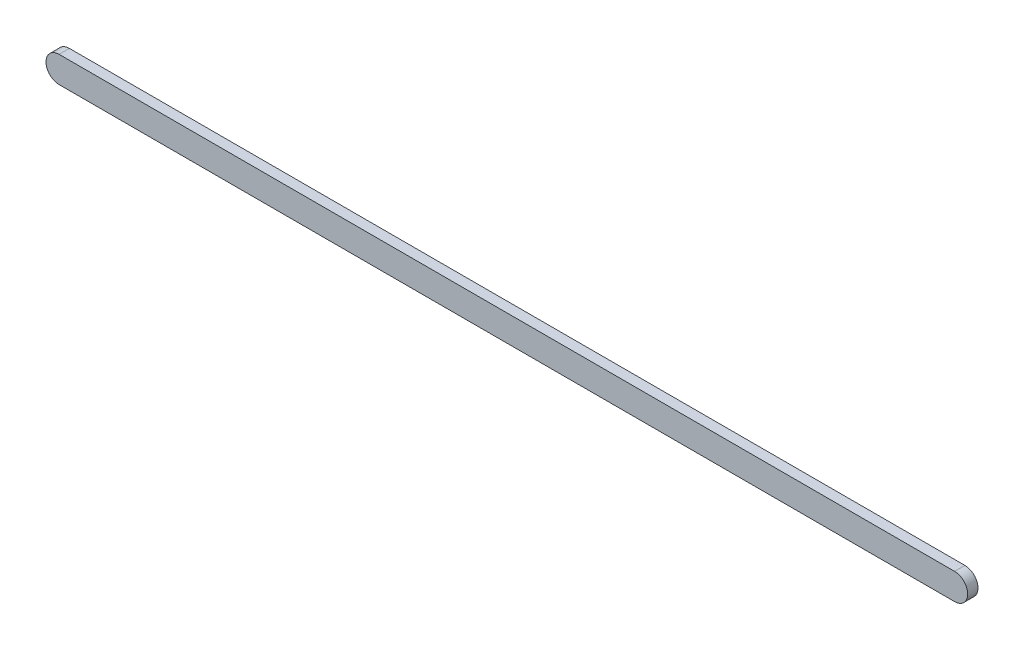
ISO-10303-21;
HEADER;
FILE_DESCRIPTION(('STEP AP214'),'2;1');
FILE_NAME('part.step','',(''),(''),'','','');
FILE_SCHEMA(('AUTOMOTIVE_DESIGN { 1 0 10303 214 1 1 1 1 }'));
ENDSEC;
DATA;
#1=APPLICATION_CONTEXT('core data for automotive mechanical design processes');
#2=APPLICATION_PROTOCOL_DEFINITION('international standard','automotive_design',2000,#1);
#3=PRODUCT_CONTEXT('',#1,'mechanical');
#4=PRODUCT('Part','Part','',(#3));
#5=PRODUCT_RELATED_PRODUCT_CATEGORY('part','',(#4));
#6=PRODUCT_DEFINITION_FORMATION('','',#4);
#7=PRODUCT_DEFINITION_CONTEXT('part definition',#1,'design');
#8=PRODUCT_DEFINITION('design','',#6,#7);
#9=PRODUCT_DEFINITION_SHAPE('','',#8);
#10=(LENGTH_UNIT() NAMED_UNIT(*) SI_UNIT(.MILLI.,.METRE.));
#11=(NAMED_UNIT(*) PLANE_ANGLE_UNIT() SI_UNIT($,.RADIAN.));
#12=(NAMED_UNIT(*) SI_UNIT($,.STERADIAN.) SOLID_ANGLE_UNIT());
#13=UNCERTAINTY_MEASURE_WITH_UNIT(LENGTH_MEASURE(1.E-05),#10,'distance_accuracy_value','');
#14=(GEOMETRIC_REPRESENTATION_CONTEXT(3) GLOBAL_UNCERTAINTY_ASSIGNED_CONTEXT((#13)) GLOBAL_UNIT_ASSIGNED_CONTEXT((#10,
#11,#12)) REPRESENTATION_CONTEXT('',''));
#15=CARTESIAN_POINT('',(0.,0.,0.));
#16=DIRECTION('',(0.,0.,1.));
#17=DIRECTION('',(1.,0.,0.));
#18=AXIS2_PLACEMENT_3D('',#15,#16,#17);
#19=CARTESIAN_POINT('',(110.363,63.6524,0.));
#20=DIRECTION('',(0.,1.,0.));
#21=DIRECTION('',(1.,0.,0.));
#22=AXIS2_PLACEMENT_3D('',#19,#20,#21);
#23=PLANE('',#22);
#24=DIRECTION('',(1.,0.,0.));
#25=VECTOR('',#24,1.);
#26=CARTESIAN_POINT('',(110.363,63.6524,0.1999996));
#27=LINE('',#26,#25);
#28=CARTESIAN_POINT('',(110.363,63.6524,0.1999996));
#29=VERTEX_POINT('',#28);
#30=CARTESIAN_POINT('',(127.7176008,63.6524,0.1999996));
#31=VERTEX_POINT('',#30);
#32=EDGE_CURVE('E11',#29,#31,#27,.T.);
#33=ORIENTED_EDGE('',*,*,#32,.F.);
#34=DIRECTION('',(0.,0.,1.));
#35=VECTOR('',#34,1.);
#36=CARTESIAN_POINT('',(110.363,63.6524,0.));
#37=LINE('',#36,#35);
#38=CARTESIAN_POINT('',(110.363,63.6524,0.));
#39=VERTEX_POINT('',#38);
#40=EDGE_CURVE('E24',#39,#29,#37,.T.);
#41=ORIENTED_EDGE('',*,*,#40,.F.);
#42=DIRECTION('',(1.,0.,0.));
#43=VECTOR('',#42,1.);
#44=CARTESIAN_POINT('',(110.363,63.6524,0.));
#45=LINE('',#44,#43);
#46=CARTESIAN_POINT('',(127.7176008,63.6524,0.));
#47=VERTEX_POINT('',#46);
#48=EDGE_CURVE('E75',#39,#47,#45,.T.);
#49=ORIENTED_EDGE('',*,*,#48,.T.);
#50=DIRECTION('',(0.,0.,1.));
#51=VECTOR('',#50,1.);
#52=CARTESIAN_POINT('',(127.7176008,63.6524,0.));
#53=LINE('',#52,#51);
#54=EDGE_CURVE('E37',#47,#31,#53,.T.);
#55=ORIENTED_EDGE('',*,*,#54,.T.);
#56=EDGE_LOOP('',(#33,#41,#49,#55));
#57=FACE_BOUND('',#56,.T.);
#58=ADVANCED_FACE('F17',(#57),#23,.F.);
#59=CARTESIAN_POINT('',(127.7176008,63.9064,0.));
#60=DIRECTION('',(0.,0.,-1.));
#61=DIRECTION('',(0.,-1.,0.));
#62=AXIS2_PLACEMENT_3D('',#59,#60,#61);
#63=CYLINDRICAL_SURFACE('',#62,0.253999999999995);
#64=CARTESIAN_POINT('',(127.7176008,63.9064,0.1999996));
#65=DIRECTION('',(0.,0.,1.));
#66=DIRECTION('',(0.,-1.,0.));
#67=AXIS2_PLACEMENT_3D('',#64,#65,#66);
#68=CIRCLE('',#67,0.253999999999995);
#69=CARTESIAN_POINT('',(127.7176008,64.1604,0.1999996));
#70=VERTEX_POINT('',#69);
#71=EDGE_CURVE('E83',#31,#70,#68,.T.);
#72=ORIENTED_EDGE('',*,*,#71,.F.);
#73=ORIENTED_EDGE('',*,*,#54,.F.);
#74=CARTESIAN_POINT('',(127.7176008,63.9064,0.));
#75=DIRECTION('',(0.,0.,1.));
#76=DIRECTION('',(0.,-1.,0.));
#77=AXIS2_PLACEMENT_3D('',#74,#75,#76);
#78=CIRCLE('',#77,0.253999999999995);
#79=CARTESIAN_POINT('',(127.7176008,64.1604,0.));
#80=VERTEX_POINT('',#79);
#81=EDGE_CURVE('E81',#47,#80,#78,.T.);
#82=ORIENTED_EDGE('',*,*,#81,.T.);
#83=DIRECTION('',(0.,0.,1.));
#84=VECTOR('',#83,1.);
#85=CARTESIAN_POINT('',(127.7176008,64.1604,0.));
#86=LINE('',#85,#84);
#87=EDGE_CURVE('E67',#80,#70,#86,.T.);
#88=ORIENTED_EDGE('',*,*,#87,.T.);
#89=EDGE_LOOP('',(#72,#73,#82,#88));
#90=FACE_BOUND('',#89,.T.);
#91=ADVANCED_FACE('F89',(#90),#63,.T.);
#92=CARTESIAN_POINT('',(127.7176008,64.1604,0.));
#93=DIRECTION('',(0.,-1.,0.));
#94=DIRECTION('',(-1.,0.,0.));
#95=AXIS2_PLACEMENT_3D('',#92,#93,#94);
#96=PLANE('',#95);
#97=DIRECTION('',(-1.,0.,0.));
#98=VECTOR('',#97,1.);
#99=CARTESIAN_POINT('',(127.7176008,64.1604,0.1999996));
#100=LINE('',#99,#98);
#101=CARTESIAN_POINT('',(110.363,64.1604,0.1999996));
#102=VERTEX_POINT('',#101);
#103=EDGE_CURVE('E71',#70,#102,#100,.T.);
#104=ORIENTED_EDGE('',*,*,#103,.F.);
#105=ORIENTED_EDGE('',*,*,#87,.F.);
#106=DIRECTION('',(-1.,0.,0.));
#107=VECTOR('',#106,1.);
#108=CARTESIAN_POINT('',(127.7176008,64.1604,0.));
#109=LINE('',#108,#107);
#110=CARTESIAN_POINT('',(110.363,64.1604,0.));
#111=VERTEX_POINT('',#110);
#112=EDGE_CURVE('E63',#80,#111,#109,.T.);
#113=ORIENTED_EDGE('',*,*,#112,.T.);
#114=DIRECTION('',(0.,0.,1.));
#115=VECTOR('',#114,1.);
#116=CARTESIAN_POINT('',(110.363,64.1604,0.));
#117=LINE('',#116,#115);
#118=EDGE_CURVE('E53',#111,#102,#117,.T.);
#119=ORIENTED_EDGE('',*,*,#118,.T.);
#120=EDGE_LOOP('',(#104,#105,#113,#119));
#121=FACE_BOUND('',#120,.T.);
#122=ADVANCED_FACE('F66',(#121),#96,.F.);
#123=CARTESIAN_POINT('',(110.363,63.9064,0.));
#124=DIRECTION('',(0.,0.,-1.));
#125=DIRECTION('',(0.,1.,0.));
#126=AXIS2_PLACEMENT_3D('',#123,#124,#125);
#127=CYLINDRICAL_SURFACE('',#126,0.253999999999995);
#128=CARTESIAN_POINT('',(110.363,63.9064,0.1999996));
#129=DIRECTION('',(0.,0.,1.));
#130=DIRECTION('',(0.,1.,0.));
#131=AXIS2_PLACEMENT_3D('',#128,#129,#130);
#132=CIRCLE('',#131,0.253999999999995);
#133=EDGE_CURVE('E59',#102,#29,#132,.T.);
#134=ORIENTED_EDGE('',*,*,#133,.F.);
#135=ORIENTED_EDGE('',*,*,#118,.F.);
#136=CARTESIAN_POINT('',(110.363,63.9064,0.));
#137=DIRECTION('',(0.,0.,1.));
#138=DIRECTION('',(0.,1.,0.));
#139=AXIS2_PLACEMENT_3D('',#136,#137,#138);
#140=CIRCLE('',#139,0.253999999999995);
#141=EDGE_CURVE('E57',#111,#39,#140,.T.);
#142=ORIENTED_EDGE('',*,*,#141,.T.);
#143=ORIENTED_EDGE('',*,*,#40,.T.);
#144=EDGE_LOOP('',(#134,#135,#142,#143));
#145=FACE_BOUND('',#144,.T.);
#146=ADVANCED_FACE('F55',(#145),#127,.T.);
#147=CARTESIAN_POINT('',(110.363,63.6524,0.));
#148=DIRECTION('',(0.,0.,-1.));
#149=DIRECTION('',(-1.,0.,0.));
#150=AXIS2_PLACEMENT_3D('',#147,#148,#149);
#151=PLANE('',#150);
#152=ORIENTED_EDGE('',*,*,#141,.F.);
#153=ORIENTED_EDGE('',*,*,#112,.F.);
#154=ORIENTED_EDGE('',*,*,#81,.F.);
#155=ORIENTED_EDGE('',*,*,#48,.F.);
#156=EDGE_LOOP('',(#152,#153,#154,#155));
#157=FACE_BOUND('',#156,.T.);
#158=ADVANCED_FACE('F74',(#157),#151,.T.);
#159=CARTESIAN_POINT('',(110.363,63.6524,0.1999996));
#160=DIRECTION('',(0.,0.,-1.));
#161=DIRECTION('',(-1.,0.,0.));
#162=AXIS2_PLACEMENT_3D('',#159,#160,#161);
#163=PLANE('',#162);
#164=ORIENTED_EDGE('',*,*,#32,.T.);
#165=ORIENTED_EDGE('',*,*,#71,.T.);
#166=ORIENTED_EDGE('',*,*,#103,.T.);
#167=ORIENTED_EDGE('',*,*,#133,.T.);
#168=EDGE_LOOP('',(#164,#165,#166,#167));
#169=FACE_BOUND('',#168,.T.);
#170=ADVANCED_FACE('F91',(#169),#163,.F.);
#171=CLOSED_SHELL('',(#58,#91,#122,#146,#158,#170));
#172=MANIFOLD_SOLID_BREP('B1',#171);
#173=ADVANCED_BREP_SHAPE_REPRESENTATION('',(#18,#172),#14);
#174=SHAPE_DEFINITION_REPRESENTATION(#9,#173);
ENDSEC;
END-ISO-10303-21;
